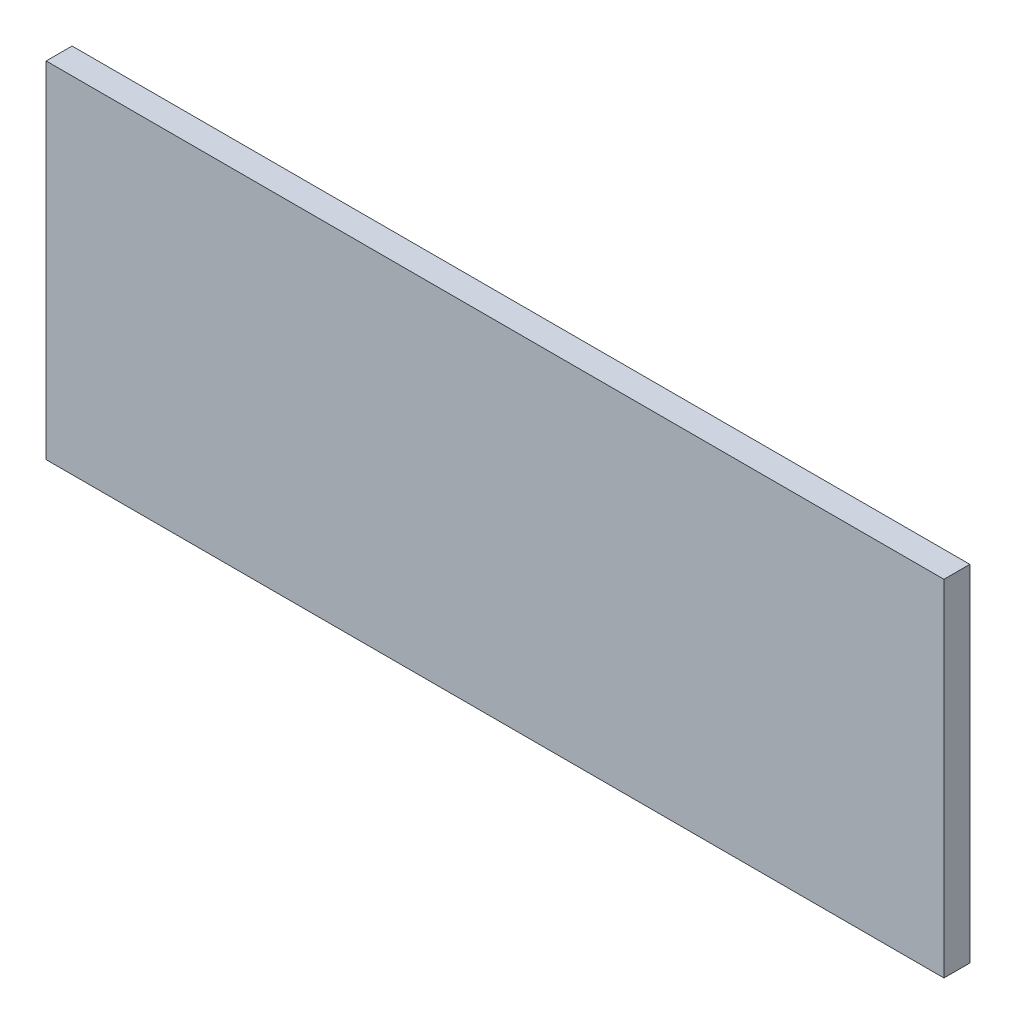
ISO-10303-21;
HEADER;
FILE_DESCRIPTION(('STEP AP214'),'2;1');
FILE_NAME('part.step','',(''),(''),'','','');
FILE_SCHEMA(('AUTOMOTIVE_DESIGN { 1 0 10303 214 1 1 1 1 }'));
ENDSEC;
DATA;
#1=APPLICATION_CONTEXT('core data for automotive mechanical design processes');
#2=APPLICATION_PROTOCOL_DEFINITION('international standard','automotive_design',2000,#1);
#3=PRODUCT_CONTEXT('',#1,'mechanical');
#4=PRODUCT('Part','Part','',(#3));
#5=PRODUCT_RELATED_PRODUCT_CATEGORY('part','',(#4));
#6=PRODUCT_DEFINITION_FORMATION('','',#4);
#7=PRODUCT_DEFINITION_CONTEXT('part definition',#1,'design');
#8=PRODUCT_DEFINITION('design','',#6,#7);
#9=PRODUCT_DEFINITION_SHAPE('','',#8);
#10=(LENGTH_UNIT() NAMED_UNIT(*) SI_UNIT(.MILLI.,.METRE.));
#11=(NAMED_UNIT(*) PLANE_ANGLE_UNIT() SI_UNIT($,.RADIAN.));
#12=(NAMED_UNIT(*) SI_UNIT($,.STERADIAN.) SOLID_ANGLE_UNIT());
#13=UNCERTAINTY_MEASURE_WITH_UNIT(LENGTH_MEASURE(1.E-05),#10,'distance_accuracy_value','');
#14=(GEOMETRIC_REPRESENTATION_CONTEXT(3) GLOBAL_UNCERTAINTY_ASSIGNED_CONTEXT((#13)) GLOBAL_UNIT_ASSIGNED_CONTEXT((#10,
#11,#12)) REPRESENTATION_CONTEXT('',''));
#15=CARTESIAN_POINT('',(0.,0.,0.));
#16=DIRECTION('',(0.,0.,1.));
#17=DIRECTION('',(1.,0.,0.));
#18=AXIS2_PLACEMENT_3D('',#15,#16,#17);
#19=CARTESIAN_POINT('',(-55.88,21.23,3.));
#20=DIRECTION('',(1.,0.,0.));
#21=DIRECTION('',(0.,1.,0.));
#22=AXIS2_PLACEMENT_3D('',#19,#20,#21);
#23=PLANE('',#22);
#24=DIRECTION('',(0.,-1.,0.));
#25=VECTOR('',#24,1.);
#26=CARTESIAN_POINT('',(-55.88,21.23,0.));
#27=LINE('',#26,#25);
#28=CARTESIAN_POINT('',(-55.88,21.23,0.));
#29=VERTEX_POINT('',#28);
#30=CARTESIAN_POINT('',(-55.88,-18.77,0.));
#31=VERTEX_POINT('',#30);
#32=EDGE_CURVE('E107',#29,#31,#27,.T.);
#33=ORIENTED_EDGE('',*,*,#32,.T.);
#34=DIRECTION('',(0.,0.,-1.));
#35=VECTOR('',#34,1.);
#36=CARTESIAN_POINT('',(-55.88,-18.77,3.));
#37=LINE('',#36,#35);
#38=CARTESIAN_POINT('',(-55.88,-18.77,3.));
#39=VERTEX_POINT('',#38);
#40=EDGE_CURVE('E11',#39,#31,#37,.T.);
#41=ORIENTED_EDGE('',*,*,#40,.F.);
#42=DIRECTION('',(0.,-1.,0.));
#43=VECTOR('',#42,1.);
#44=CARTESIAN_POINT('',(-55.88,21.23,3.));
#45=LINE('',#44,#43);
#46=CARTESIAN_POINT('',(-55.88,21.23,3.));
#47=VERTEX_POINT('',#46);
#48=EDGE_CURVE('E91',#47,#39,#45,.T.);
#49=ORIENTED_EDGE('',*,*,#48,.F.);
#50=DIRECTION('',(0.,0.,-1.));
#51=VECTOR('',#50,1.);
#52=CARTESIAN_POINT('',(-55.88,21.23,3.));
#53=LINE('',#52,#51);
#54=EDGE_CURVE('E103',#47,#29,#53,.T.);
#55=ORIENTED_EDGE('',*,*,#54,.T.);
#56=EDGE_LOOP('',(#33,#41,#49,#55));
#57=FACE_BOUND('',#56,.T.);
#58=ADVANCED_FACE('F39',(#57),#23,.F.);
#59=CARTESIAN_POINT('',(-55.88,-18.77,3.));
#60=DIRECTION('',(0.,1.,0.));
#61=DIRECTION('',(0.,0.,1.));
#62=AXIS2_PLACEMENT_3D('',#59,#60,#61);
#63=PLANE('',#62);
#64=DIRECTION('',(1.,0.,0.));
#65=VECTOR('',#64,1.);
#66=CARTESIAN_POINT('',(-55.88,-18.77,0.));
#67=LINE('',#66,#65);
#68=CARTESIAN_POINT('',(48.12,-18.77,0.));
#69=VERTEX_POINT('',#68);
#70=EDGE_CURVE('E96',#31,#69,#67,.T.);
#71=ORIENTED_EDGE('',*,*,#70,.T.);
#72=DIRECTION('',(0.,0.,-1.));
#73=VECTOR('',#72,1.);
#74=CARTESIAN_POINT('',(48.12,-18.77,3.));
#75=LINE('',#74,#73);
#76=CARTESIAN_POINT('',(48.12,-18.77,3.));
#77=VERTEX_POINT('',#76);
#78=EDGE_CURVE('E48',#77,#69,#75,.T.);
#79=ORIENTED_EDGE('',*,*,#78,.F.);
#80=DIRECTION('',(1.,0.,0.));
#81=VECTOR('',#80,1.);
#82=CARTESIAN_POINT('',(-55.88,-18.77,3.));
#83=LINE('',#82,#81);
#84=EDGE_CURVE('E86',#39,#77,#83,.T.);
#85=ORIENTED_EDGE('',*,*,#84,.F.);
#86=ORIENTED_EDGE('',*,*,#40,.T.);
#87=EDGE_LOOP('',(#71,#79,#85,#86));
#88=FACE_BOUND('',#87,.T.);
#89=ADVANCED_FACE('F95',(#88),#63,.F.);
#90=CARTESIAN_POINT('',(48.12,21.23,3.));
#91=DIRECTION('',(-1.,0.,0.));
#92=DIRECTION('',(0.,0.,1.));
#93=AXIS2_PLACEMENT_3D('',#90,#91,#92);
#94=PLANE('',#93);
#95=DIRECTION('',(0.,1.,0.));
#96=VECTOR('',#95,1.);
#97=CARTESIAN_POINT('',(48.12,21.23,0.));
#98=LINE('',#97,#96);
#99=CARTESIAN_POINT('',(48.12,21.23,0.));
#100=VERTEX_POINT('',#99);
#101=EDGE_CURVE('E73',#69,#100,#98,.T.);
#102=ORIENTED_EDGE('',*,*,#101,.T.);
#103=DIRECTION('',(0.,0.,-1.));
#104=VECTOR('',#103,1.);
#105=CARTESIAN_POINT('',(48.12,21.23,3.));
#106=LINE('',#105,#104);
#107=CARTESIAN_POINT('',(48.12,21.23,3.));
#108=VERTEX_POINT('',#107);
#109=EDGE_CURVE('E98',#108,#100,#106,.T.);
#110=ORIENTED_EDGE('',*,*,#109,.F.);
#111=DIRECTION('',(0.,1.,0.));
#112=VECTOR('',#111,1.);
#113=CARTESIAN_POINT('',(48.12,21.23,3.));
#114=LINE('',#113,#112);
#115=EDGE_CURVE('E89',#77,#108,#114,.T.);
#116=ORIENTED_EDGE('',*,*,#115,.F.);
#117=ORIENTED_EDGE('',*,*,#78,.T.);
#118=EDGE_LOOP('',(#102,#110,#116,#117));
#119=FACE_BOUND('',#118,.T.);
#120=ADVANCED_FACE('F99',(#119),#94,.F.);
#121=CARTESIAN_POINT('',(-55.88,21.23,3.));
#122=DIRECTION('',(0.,-1.,0.));
#123=DIRECTION('',(0.,0.,-1.));
#124=AXIS2_PLACEMENT_3D('',#121,#122,#123);
#125=PLANE('',#124);
#126=DIRECTION('',(-1.,0.,0.));
#127=VECTOR('',#126,1.);
#128=CARTESIAN_POINT('',(-55.88,21.23,0.));
#129=LINE('',#128,#127);
#130=EDGE_CURVE('E79',#100,#29,#129,.T.);
#131=ORIENTED_EDGE('',*,*,#130,.T.);
#132=ORIENTED_EDGE('',*,*,#54,.F.);
#133=DIRECTION('',(-1.,0.,0.));
#134=VECTOR('',#133,1.);
#135=CARTESIAN_POINT('',(-55.88,21.23,3.));
#136=LINE('',#135,#134);
#137=EDGE_CURVE('E56',#108,#47,#136,.T.);
#138=ORIENTED_EDGE('',*,*,#137,.F.);
#139=ORIENTED_EDGE('',*,*,#109,.T.);
#140=EDGE_LOOP('',(#131,#132,#138,#139));
#141=FACE_BOUND('',#140,.T.);
#142=ADVANCED_FACE('F120',(#141),#125,.F.);
#143=CARTESIAN_POINT('',(0.,0.,3.));
#144=DIRECTION('',(0.,0.,1.));
#145=DIRECTION('',(1.,0.,0.));
#146=AXIS2_PLACEMENT_3D('',#143,#144,#145);
#147=PLANE('',#146);
#148=ORIENTED_EDGE('',*,*,#48,.T.);
#149=ORIENTED_EDGE('',*,*,#84,.T.);
#150=ORIENTED_EDGE('',*,*,#115,.T.);
#151=ORIENTED_EDGE('',*,*,#137,.T.);
#152=EDGE_LOOP('',(#148,#149,#150,#151));
#153=FACE_BOUND('',#152,.T.);
#154=ADVANCED_FACE('F87',(#153),#147,.T.);
#155=CARTESIAN_POINT('',(0.,0.,0.));
#156=DIRECTION('',(0.,0.,1.));
#157=DIRECTION('',(1.,0.,0.));
#158=AXIS2_PLACEMENT_3D('',#155,#156,#157);
#159=PLANE('',#158);
#160=ORIENTED_EDGE('',*,*,#32,.F.);
#161=ORIENTED_EDGE('',*,*,#130,.F.);
#162=ORIENTED_EDGE('',*,*,#101,.F.);
#163=ORIENTED_EDGE('',*,*,#70,.F.);
#164=EDGE_LOOP('',(#160,#161,#162,#163));
#165=FACE_BOUND('',#164,.T.);
#166=ADVANCED_FACE('F123',(#165),#159,.F.);
#167=CLOSED_SHELL('',(#58,#89,#120,#142,#154,#166));
#168=MANIFOLD_SOLID_BREP('B2',#167);
#169=ADVANCED_BREP_SHAPE_REPRESENTATION('',(#18,#168),#14);
#170=SHAPE_DEFINITION_REPRESENTATION(#9,#169);
ENDSEC;
END-ISO-10303-21;
